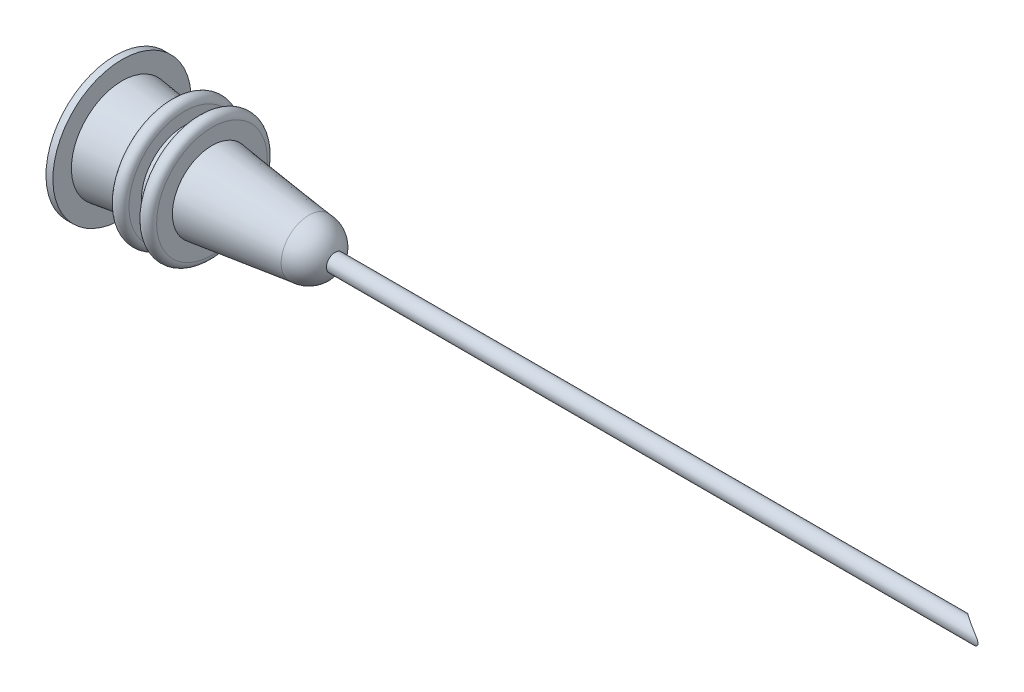
ISO-10303-21;
HEADER;
FILE_DESCRIPTION(('STEP AP214'),'2;1');
FILE_NAME('part.step','',(''),(''),'','','');
FILE_SCHEMA(('AUTOMOTIVE_DESIGN { 1 0 10303 214 1 1 1 1 }'));
ENDSEC;
DATA;
#1=APPLICATION_CONTEXT('core data for automotive mechanical design processes');
#2=APPLICATION_PROTOCOL_DEFINITION('international standard','automotive_design',2000,#1);
#3=PRODUCT_CONTEXT('',#1,'mechanical');
#4=PRODUCT('Part','Part','',(#3));
#5=PRODUCT_RELATED_PRODUCT_CATEGORY('part','',(#4));
#6=PRODUCT_DEFINITION_FORMATION('','',#4);
#7=PRODUCT_DEFINITION_CONTEXT('part definition',#1,'design');
#8=PRODUCT_DEFINITION('design','',#6,#7);
#9=PRODUCT_DEFINITION_SHAPE('','',#8);
#10=(LENGTH_UNIT() NAMED_UNIT(*) SI_UNIT(.MILLI.,.METRE.));
#11=(NAMED_UNIT(*) PLANE_ANGLE_UNIT() SI_UNIT($,.RADIAN.));
#12=(NAMED_UNIT(*) SI_UNIT($,.STERADIAN.) SOLID_ANGLE_UNIT());
#13=UNCERTAINTY_MEASURE_WITH_UNIT(LENGTH_MEASURE(1.E-05),#10,'distance_accuracy_value','');
#14=(GEOMETRIC_REPRESENTATION_CONTEXT(3) GLOBAL_UNCERTAINTY_ASSIGNED_CONTEXT((#13)) GLOBAL_UNIT_ASSIGNED_CONTEXT((#10,
#11,#12)) REPRESENTATION_CONTEXT('',''));
#15=CARTESIAN_POINT('',(0.,0.,0.));
#16=DIRECTION('',(0.,0.,1.));
#17=DIRECTION('',(1.,0.,0.));
#18=AXIS2_PLACEMENT_3D('',#15,#16,#17);
#19=CARTESIAN_POINT('',(0.,0.,0.));
#20=DIRECTION('',(0.,0.,1.));
#21=DIRECTION('',(1.,0.,0.));
#22=AXIS2_PLACEMENT_3D('',#19,#20,#21);
#23=SPHERICAL_SURFACE('',#22,2.);
#24=CARTESIAN_POINT('',(0.,0.,0.));
#25=DIRECTION('',(-1.,0.,0.));
#26=DIRECTION('',(0.,-1.,0.));
#27=AXIS2_PLACEMENT_3D('',#24,#25,#26);
#28=SPHERICAL_SURFACE('',#27,2.);
#29=CARTESIAN_POINT('',(1.89983551919633,0.,0.));
#30=DIRECTION('',(-1.,0.,0.));
#31=DIRECTION('',(0.,-1.,0.));
#32=AXIS2_PLACEMENT_3D('',#29,#30,#31);
#33=CIRCLE('',#32,0.625);
#34=CARTESIAN_POINT('',(1.89983551919633,-0.625,0.));
#35=VERTEX_POINT('',#34);
#36=EDGE_CURVE('E11',#35,#35,#33,.F.);
#37=ORIENTED_EDGE('',*,*,#36,.F.);
#38=EDGE_LOOP('',(#37));
#39=FACE_BOUND('',#38,.T.);
#40=CARTESIAN_POINT('',(0.,0.,0.));
#41=DIRECTION('',(1.,0.,0.));
#42=DIRECTION('',(0.,1.,0.));
#43=AXIS2_PLACEMENT_3D('',#40,#41,#42);
#44=CIRCLE('',#43,2.);
#45=CARTESIAN_POINT('',(0.,2.,0.));
#46=VERTEX_POINT('',#45);
#47=EDGE_CURVE('E39',#46,#46,#44,.T.);
#48=ORIENTED_EDGE('',*,*,#47,.T.);
#49=EDGE_LOOP('',(#48));
#50=FACE_BOUND('',#49,.T.);
#51=ADVANCED_FACE('F36',(#39,#50),#28,.T.);
#52=CARTESIAN_POINT('',(-1.,0.,0.));
#53=DIRECTION('',(-1.,0.,0.));
#54=DIRECTION('',(0.,-1.,0.));
#55=AXIS2_PLACEMENT_3D('',#52,#53,#54);
#56=PLANE('',#55);
#57=CARTESIAN_POINT('',(-1.,0.,0.));
#58=DIRECTION('',(1.,0.,0.));
#59=DIRECTION('',(0.,1.,0.));
#60=AXIS2_PLACEMENT_3D('',#57,#58,#59);
#61=CIRCLE('',#60,1.36741780015232);
#62=CARTESIAN_POINT('',(-1.,1.36741780015233,0.));
#63=VERTEX_POINT('',#62);
#64=EDGE_CURVE('E43',#63,#63,#61,.T.);
#65=ORIENTED_EDGE('',*,*,#64,.F.);
#66=EDGE_LOOP('',(#65));
#67=FACE_BOUND('',#66,.T.);
#68=CARTESIAN_POINT('',(-1.,0.,0.));
#69=DIRECTION('',(-1.,0.,0.));
#70=DIRECTION('',(0.,-1.,0.));
#71=AXIS2_PLACEMENT_3D('',#68,#69,#70);
#72=CIRCLE('',#71,0.5);
#73=CARTESIAN_POINT('',(-1.,-0.500000000000001,0.));
#74=VERTEX_POINT('',#73);
#75=EDGE_CURVE('E58',#74,#74,#72,.T.);
#76=ORIENTED_EDGE('',*,*,#75,.F.);
#77=EDGE_LOOP('',(#76));
#78=FACE_BOUND('',#77,.T.);
#79=ADVANCED_FACE('F102',(#67,#78),#56,.T.);
#80=CARTESIAN_POINT('',(-14.,0.,0.));
#81=DIRECTION('',(-1.,0.,0.));
#82=DIRECTION('',(0.,-1.,0.));
#83=AXIS2_PLACEMENT_3D('',#80,#81,#82);
#84=CONICAL_SURFACE('',#83,2.96741780015232,0.122461057417342);
#85=ORIENTED_EDGE('',*,*,#64,.T.);
#86=EDGE_LOOP('',(#85));
#87=FACE_BOUND('',#86,.T.);
#88=CARTESIAN_POINT('',(-14.,0.,0.));
#89=DIRECTION('',(1.,0.,0.));
#90=DIRECTION('',(0.,1.,0.));
#91=AXIS2_PLACEMENT_3D('',#88,#89,#90);
#92=CIRCLE('',#91,2.96741780015232);
#93=CARTESIAN_POINT('',(-14.,2.96741780015233,0.));
#94=VERTEX_POINT('',#93);
#95=EDGE_CURVE('E48',#94,#94,#92,.T.);
#96=ORIENTED_EDGE('',*,*,#95,.F.);
#97=EDGE_LOOP('',(#96));
#98=FACE_BOUND('',#97,.T.);
#99=ADVANCED_FACE('F100',(#87,#98),#84,.F.);
#100=CARTESIAN_POINT('',(-14.,2.96741780015233,0.));
#101=DIRECTION('',(-1.,0.,0.));
#102=DIRECTION('',(0.,-1.,0.));
#103=AXIS2_PLACEMENT_3D('',#100,#101,#102);
#104=PLANE('',#103);
#105=ORIENTED_EDGE('',*,*,#95,.T.);
#106=EDGE_LOOP('',(#105));
#107=FACE_BOUND('',#106,.T.);
#108=CARTESIAN_POINT('',(-14.,0.,0.));
#109=DIRECTION('',(1.,0.,0.));
#110=DIRECTION('',(0.,1.,0.));
#111=AXIS2_PLACEMENT_3D('',#108,#109,#110);
#112=CIRCLE('',#111,5.);
#113=CARTESIAN_POINT('',(-14.,5.,0.));
#114=VERTEX_POINT('',#113);
#115=EDGE_CURVE('E91',#114,#114,#112,.T.);
#116=ORIENTED_EDGE('',*,*,#115,.F.);
#117=EDGE_LOOP('',(#116));
#118=FACE_BOUND('',#117,.T.);
#119=ADVANCED_FACE('F97',(#107,#118),#104,.T.);
#120=CARTESIAN_POINT('',(18.5171919282144,0.,0.));
#121=DIRECTION('',(1.,0.,0.));
#122=DIRECTION('',(0.,1.,0.));
#123=AXIS2_PLACEMENT_3D('',#120,#121,#122);
#124=CYLINDRICAL_SURFACE('',#123,5.);
#125=ORIENTED_EDGE('',*,*,#115,.T.);
#126=EDGE_LOOP('',(#125));
#127=FACE_BOUND('',#126,.T.);
#128=CARTESIAN_POINT('',(-13.5,0.,0.));
#129=DIRECTION('',(1.,0.,0.));
#130=DIRECTION('',(0.,1.,0.));
#131=AXIS2_PLACEMENT_3D('',#128,#129,#130);
#132=CIRCLE('',#131,5.);
#133=CARTESIAN_POINT('',(-13.5,5.,0.));
#134=VERTEX_POINT('',#133);
#135=EDGE_CURVE('E88',#134,#134,#132,.T.);
#136=ORIENTED_EDGE('',*,*,#135,.F.);
#137=EDGE_LOOP('',(#136));
#138=FACE_BOUND('',#137,.T.);
#139=ADVANCED_FACE('F109',(#127,#138),#124,.T.);
#140=CARTESIAN_POINT('',(-13.5,5.,0.));
#141=DIRECTION('',(1.,0.,0.));
#142=DIRECTION('',(0.,1.,0.));
#143=AXIS2_PLACEMENT_3D('',#140,#141,#142);
#144=PLANE('',#143);
#145=ORIENTED_EDGE('',*,*,#135,.T.);
#146=EDGE_LOOP('',(#145));
#147=FACE_BOUND('',#146,.T.);
#148=CARTESIAN_POINT('',(-13.5,0.,0.));
#149=DIRECTION('',(1.,0.,0.));
#150=DIRECTION('',(0.,1.,0.));
#151=AXIS2_PLACEMENT_3D('',#148,#149,#150);
#152=CIRCLE('',#151,3.66153846153846);
#153=CARTESIAN_POINT('',(-13.5,3.66153846153846,0.));
#154=VERTEX_POINT('',#153);
#155=EDGE_CURVE('E85',#154,#154,#152,.T.);
#156=ORIENTED_EDGE('',*,*,#155,.F.);
#157=EDGE_LOOP('',(#156));
#158=FACE_BOUND('',#157,.T.);
#159=ADVANCED_FACE('F164',(#147,#158),#144,.T.);
#160=CARTESIAN_POINT('',(-10.,0.,0.));
#161=DIRECTION('',(-1.,0.,0.));
#162=DIRECTION('',(0.,-1.,0.));
#163=AXIS2_PLACEMENT_3D('',#160,#161,#162);
#164=CONICAL_SURFACE('',#163,3.23076923076923,0.122461057417342);
#165=ORIENTED_EDGE('',*,*,#155,.T.);
#166=EDGE_LOOP('',(#165));
#167=FACE_BOUND('',#166,.T.);
#168=CARTESIAN_POINT('',(-10.,0.,0.));
#169=DIRECTION('',(1.,0.,0.));
#170=DIRECTION('',(0.,1.,0.));
#171=AXIS2_PLACEMENT_3D('',#168,#169,#170);
#172=CIRCLE('',#171,3.23076923076923);
#173=CARTESIAN_POINT('',(-10.,3.23076923076923,0.));
#174=VERTEX_POINT('',#173);
#175=EDGE_CURVE('E82',#174,#174,#172,.T.);
#176=ORIENTED_EDGE('',*,*,#175,.F.);
#177=EDGE_LOOP('',(#176));
#178=FACE_BOUND('',#177,.T.);
#179=ADVANCED_FACE('F160',(#167,#178),#164,.T.);
#180=CARTESIAN_POINT('',(-10.,3.23076923076923,0.));
#181=DIRECTION('',(-1.,0.,0.));
#182=DIRECTION('',(0.,-1.,0.));
#183=AXIS2_PLACEMENT_3D('',#180,#181,#182);
#184=PLANE('',#183);
#185=ORIENTED_EDGE('',*,*,#175,.T.);
#186=EDGE_LOOP('',(#185));
#187=FACE_BOUND('',#186,.T.);
#188=CARTESIAN_POINT('',(-10.,0.,0.));
#189=DIRECTION('',(1.,0.,0.));
#190=DIRECTION('',(0.,1.,0.));
#191=AXIS2_PLACEMENT_3D('',#188,#189,#190);
#192=CIRCLE('',#191,4.);
#193=CARTESIAN_POINT('',(-10.,4.,0.));
#194=VERTEX_POINT('',#193);
#195=EDGE_CURVE('E79',#194,#194,#192,.T.);
#196=ORIENTED_EDGE('',*,*,#195,.F.);
#197=EDGE_LOOP('',(#196));
#198=FACE_BOUND('',#197,.T.);
#199=ADVANCED_FACE('F156',(#187,#198),#184,.T.);
#200=CARTESIAN_POINT('',(-9.5,0.,0.));
#201=DIRECTION('',(1.,0.,0.));
#202=DIRECTION('',(0.,1.,0.));
#203=AXIS2_PLACEMENT_3D('',#200,#201,#202);
#204=TOROIDAL_SURFACE('',#203,4.,0.5);
#205=ORIENTED_EDGE('',*,*,#195,.T.);
#206=EDGE_LOOP('',(#205));
#207=FACE_BOUND('',#206,.T.);
#208=CARTESIAN_POINT('',(-9.,0.,0.));
#209=DIRECTION('',(1.,0.,0.));
#210=DIRECTION('',(0.,1.,0.));
#211=AXIS2_PLACEMENT_3D('',#208,#209,#210);
#212=CIRCLE('',#211,4.);
#213=CARTESIAN_POINT('',(-9.,4.,0.));
#214=VERTEX_POINT('',#213);
#215=EDGE_CURVE('E76',#214,#214,#212,.T.);
#216=ORIENTED_EDGE('',*,*,#215,.F.);
#217=EDGE_LOOP('',(#216));
#218=FACE_BOUND('',#217,.T.);
#219=ADVANCED_FACE('F152',(#207,#218),#204,.T.);
#220=CARTESIAN_POINT('',(-9.,4.,0.));
#221=DIRECTION('',(1.,0.,0.));
#222=DIRECTION('',(0.,1.,0.));
#223=AXIS2_PLACEMENT_3D('',#220,#221,#222);
#224=PLANE('',#223);
#225=ORIENTED_EDGE('',*,*,#215,.T.);
#226=EDGE_LOOP('',(#225));
#227=FACE_BOUND('',#226,.T.);
#228=CARTESIAN_POINT('',(-9.,0.,0.));
#229=DIRECTION('',(1.,0.,0.));
#230=DIRECTION('',(0.,1.,0.));
#231=AXIS2_PLACEMENT_3D('',#228,#229,#230);
#232=CIRCLE('',#231,3.10769230769231);
#233=CARTESIAN_POINT('',(-9.,3.10769230769231,0.));
#234=VERTEX_POINT('',#233);
#235=EDGE_CURVE('E73',#234,#234,#232,.T.);
#236=ORIENTED_EDGE('',*,*,#235,.F.);
#237=EDGE_LOOP('',(#236));
#238=FACE_BOUND('',#237,.T.);
#239=ADVANCED_FACE('F148',(#227,#238),#224,.T.);
#240=CARTESIAN_POINT('',(-8.,0.,0.));
#241=DIRECTION('',(-1.,0.,0.));
#242=DIRECTION('',(0.,-1.,0.));
#243=AXIS2_PLACEMENT_3D('',#240,#241,#242);
#244=CONICAL_SURFACE('',#243,2.98461538461538,0.122461057417342);
#245=ORIENTED_EDGE('',*,*,#235,.T.);
#246=EDGE_LOOP('',(#245));
#247=FACE_BOUND('',#246,.T.);
#248=CARTESIAN_POINT('',(-8.,0.,0.));
#249=DIRECTION('',(1.,0.,0.));
#250=DIRECTION('',(0.,1.,0.));
#251=AXIS2_PLACEMENT_3D('',#248,#249,#250);
#252=CIRCLE('',#251,2.98461538461538);
#253=CARTESIAN_POINT('',(-8.,2.98461538461539,0.));
#254=VERTEX_POINT('',#253);
#255=EDGE_CURVE('E70',#254,#254,#252,.T.);
#256=ORIENTED_EDGE('',*,*,#255,.F.);
#257=EDGE_LOOP('',(#256));
#258=FACE_BOUND('',#257,.T.);
#259=ADVANCED_FACE('F144',(#247,#258),#244,.T.);
#260=CARTESIAN_POINT('',(-8.,2.98461538461539,0.));
#261=DIRECTION('',(-1.,0.,0.));
#262=DIRECTION('',(0.,-1.,0.));
#263=AXIS2_PLACEMENT_3D('',#260,#261,#262);
#264=PLANE('',#263);
#265=ORIENTED_EDGE('',*,*,#255,.T.);
#266=EDGE_LOOP('',(#265));
#267=FACE_BOUND('',#266,.T.);
#268=CARTESIAN_POINT('',(-8.,0.,0.));
#269=DIRECTION('',(1.,0.,0.));
#270=DIRECTION('',(0.,1.,0.));
#271=AXIS2_PLACEMENT_3D('',#268,#269,#270);
#272=CIRCLE('',#271,4.);
#273=CARTESIAN_POINT('',(-8.,4.,0.));
#274=VERTEX_POINT('',#273);
#275=EDGE_CURVE('E67',#274,#274,#272,.T.);
#276=ORIENTED_EDGE('',*,*,#275,.F.);
#277=EDGE_LOOP('',(#276));
#278=FACE_BOUND('',#277,.T.);
#279=ADVANCED_FACE('F140',(#267,#278),#264,.T.);
#280=CARTESIAN_POINT('',(-7.5,0.,0.));
#281=DIRECTION('',(1.,0.,0.));
#282=DIRECTION('',(0.,1.,0.));
#283=AXIS2_PLACEMENT_3D('',#280,#281,#282);
#284=TOROIDAL_SURFACE('',#283,4.,0.5);
#285=ORIENTED_EDGE('',*,*,#275,.T.);
#286=EDGE_LOOP('',(#285));
#287=FACE_BOUND('',#286,.T.);
#288=CARTESIAN_POINT('',(-7.,0.,0.));
#289=DIRECTION('',(1.,0.,0.));
#290=DIRECTION('',(0.,1.,0.));
#291=AXIS2_PLACEMENT_3D('',#288,#289,#290);
#292=CIRCLE('',#291,4.);
#293=CARTESIAN_POINT('',(-7.,4.,0.));
#294=VERTEX_POINT('',#293);
#295=EDGE_CURVE('E64',#294,#294,#292,.T.);
#296=ORIENTED_EDGE('',*,*,#295,.F.);
#297=EDGE_LOOP('',(#296));
#298=FACE_BOUND('',#297,.T.);
#299=ADVANCED_FACE('F132',(#287,#298),#284,.T.);
#300=CARTESIAN_POINT('',(-7.,4.,0.));
#301=DIRECTION('',(1.,0.,0.));
#302=DIRECTION('',(0.,1.,0.));
#303=AXIS2_PLACEMENT_3D('',#300,#301,#302);
#304=PLANE('',#303);
#305=ORIENTED_EDGE('',*,*,#295,.T.);
#306=EDGE_LOOP('',(#305));
#307=FACE_BOUND('',#306,.T.);
#308=CARTESIAN_POINT('',(-7.,0.,0.));
#309=DIRECTION('',(1.,0.,0.));
#310=DIRECTION('',(0.,1.,0.));
#311=AXIS2_PLACEMENT_3D('',#308,#309,#310);
#312=CIRCLE('',#311,2.86153846153846);
#313=CARTESIAN_POINT('',(-7.,2.86153846153846,0.));
#314=VERTEX_POINT('',#313);
#315=EDGE_CURVE('E61',#314,#314,#312,.T.);
#316=ORIENTED_EDGE('',*,*,#315,.F.);
#317=EDGE_LOOP('',(#316));
#318=FACE_BOUND('',#317,.T.);
#319=ADVANCED_FACE('F123',(#307,#318),#304,.T.);
#320=CARTESIAN_POINT('',(0.,0.,0.));
#321=DIRECTION('',(-1.,0.,0.));
#322=DIRECTION('',(0.,-1.,0.));
#323=AXIS2_PLACEMENT_3D('',#320,#321,#322);
#324=CONICAL_SURFACE('',#323,2.,0.122461057417342);
#325=ORIENTED_EDGE('',*,*,#315,.T.);
#326=EDGE_LOOP('',(#325));
#327=FACE_BOUND('',#326,.T.);
#328=ORIENTED_EDGE('',*,*,#47,.F.);
#329=EDGE_LOOP('',(#328));
#330=FACE_BOUND('',#329,.T.);
#331=ADVANCED_FACE('F120',(#327,#330),#324,.T.);
#332=CARTESIAN_POINT('',(9.,0.,0.));
#333=DIRECTION('',(-1.,0.,0.));
#334=DIRECTION('',(0.,-1.,0.));
#335=AXIS2_PLACEMENT_3D('',#332,#333,#334);
#336=CYLINDRICAL_SURFACE('',#335,0.5);
#337=CARTESIAN_POINT('',(47.7385558970049,-0.499999999999992,0.));
#338=CARTESIAN_POINT('',(47.676995088599,-0.500005799449973,-0.042235078169291));
#339=CARTESIAN_POINT('',(47.6162846639475,-0.494704632224763,-0.0859310378305494));
#340=CARTESIAN_POINT('',(47.5281793644801,-0.476774006721773,-0.152331963288639));
#341=CARTESIAN_POINT('',(47.4993668824095,-0.469162710452364,-0.174556619102596));
#342=CARTESIAN_POINT('',(47.4430232683984,-0.450144691354117,-0.218983594217453));
#343=CARTESIAN_POINT('',(47.4154904966899,-0.438742987282263,-0.241185904320831));
#344=CARTESIAN_POINT('',(47.3651681643776,-0.413100627015222,-0.282618268150626));
#345=CARTESIAN_POINT('',(47.3421923177107,-0.399319367330877,-0.301903296891395));
#346=CARTESIAN_POINT('',(47.2981452417519,-0.367871962624474,-0.339515025004838));
#347=CARTESIAN_POINT('',(47.2770733456276,-0.350207185251065,-0.357842058946733));
#348=CARTESIAN_POINT('',(47.2405683494316,-0.313593270816299,-0.390078261571014));
#349=CARTESIAN_POINT('',(47.2247641056315,-0.295239507964418,-0.404236878466846));
#350=CARTESIAN_POINT('',(47.195714770895,-0.255332596682865,-0.430550737831571));
#351=CARTESIAN_POINT('',(47.1824657217675,-0.233784489636015,-0.442709074522526));
#352=CARTESIAN_POINT('',(47.1619163987929,-0.192865755143483,-0.461725786313019));
#353=CARTESIAN_POINT('',(47.1539483972161,-0.174100803451653,-0.469161024481745));
#354=CARTESIAN_POINT('',(47.1404034600722,-0.135025720927264,-0.481859897051152));
#355=CARTESIAN_POINT('',(47.1348250190348,-0.114716572495238,-0.487124898664544));
#356=CARTESIAN_POINT('',(47.1263793254222,-0.0729109155432798,-0.495115365889011));
#357=CARTESIAN_POINT('',(47.1235290176812,-0.0514078526637709,-0.497824957973932));
#358=CARTESIAN_POINT('',(47.1208134173344,-0.00804527409233043,-0.500406140624675));
#359=CARTESIAN_POINT('',(47.1209470523331,0.0138141107192645,-0.500278750770059));
#360=CARTESIAN_POINT('',(47.1240233389691,0.054963128140177,-0.497355480554068));
#361=CARTESIAN_POINT('',(47.1266881142022,0.0742938624201266,-0.494823579595277));
#362=CARTESIAN_POINT('',(47.1342674416289,0.112097057181295,-0.487652081752012));
#363=CARTESIAN_POINT('',(47.1391822125315,0.130569434034277,-0.483012279971128));
#364=CARTESIAN_POINT('',(47.1512263274204,0.166937390667492,-0.471707674243391));
#365=CARTESIAN_POINT('',(47.1584309863832,0.18478623088042,-0.464974202528981));
#366=CARTESIAN_POINT('',(47.1746592613451,0.218907248272754,-0.449920094961737));
#367=CARTESIAN_POINT('',(47.1836838021563,0.235178617576186,-0.441598652263332));
#368=CARTESIAN_POINT('',(47.2084346937093,0.274236117592764,-0.418974395299195));
#369=CARTESIAN_POINT('',(47.2251767450906,0.295899706943548,-0.403840201371103));
#370=CARTESIAN_POINT('',(47.2612583572181,0.335358155095674,-0.371732828575432));
#371=CARTESIAN_POINT('',(47.2806042318336,0.353143325708012,-0.354755199633144));
#372=CARTESIAN_POINT('',(47.3307994701918,0.392706145922007,-0.311454534925781));
#373=CARTESIAN_POINT('',(47.3627591624382,0.412388295627073,-0.284512066709084));
#374=CARTESIAN_POINT('',(47.4292969725426,0.445136620876279,-0.229930369897814));
#375=CARTESIAN_POINT('',(47.463879349337,0.458191758555176,-0.202290058822603));
#376=CARTESIAN_POINT('',(47.5545549239408,0.484477361394398,-0.131846572969483));
#377=CARTESIAN_POINT('',(47.6118926791029,0.49374853825027,-0.0891802462609216));
#378=CARTESIAN_POINT('',(47.7288706531941,0.501708644813403,-0.0060300737365672));
#379=CARTESIAN_POINT('',(47.7885165269337,0.500369700704363,0.034447741930793));
#380=CARTESIAN_POINT('',(47.8886667563366,0.490732293894604,0.0993215233232987));
#381=CARTESIAN_POINT('',(47.9288899450182,0.484915464005122,0.124562382742691));
#382=CARTESIAN_POINT('',(48.009520150655,0.469602758680514,0.173590201011261));
#383=CARTESIAN_POINT('',(48.0499271503399,0.460107222105233,0.197377293538925));
#384=CARTESIAN_POINT('',(48.130661972557,0.437503085402526,0.243412608022169));
#385=CARTESIAN_POINT('',(48.1709896881466,0.424391171653714,0.26565939512222));
#386=CARTESIAN_POINT('',(48.251088366793,0.394388835112312,0.308447998887826));
#387=CARTESIAN_POINT('',(48.2908598603474,0.377502316697266,0.328991547462151));
#388=CARTESIAN_POINT('',(48.3680538625655,0.339961827175142,0.367604196441458));
#389=CARTESIAN_POINT('',(48.405510917831,0.319442752122185,0.385730726792278));
#390=CARTESIAN_POINT('',(48.4598376464581,0.284749820114463,0.411241729202922));
#391=CARTESIAN_POINT('',(48.4775945528335,0.272568506502724,0.419447117207181));
#392=CARTESIAN_POINT('',(48.5122103025202,0.246626060729753,0.435208955166236));
#393=CARTESIAN_POINT('',(48.5290701954962,0.232866837300773,0.442766170235407));
#394=CARTESIAN_POINT('',(48.5564802326784,0.207869621979354,0.454884377195974));
#395=CARTESIAN_POINT('',(48.5673919706924,0.197134441769109,0.459658443583044));
#396=CARTESIAN_POINT('',(48.5882630287371,0.174530550673737,0.468708474250497));
#397=CARTESIAN_POINT('',(48.5982208518927,0.16266011484232,0.472983657909155));
#398=CARTESIAN_POINT('',(48.6168230965664,0.137492065569914,0.480907686137349));
#399=CARTESIAN_POINT('',(48.6254514154017,0.124179848495268,0.484548912003253));
#400=CARTESIAN_POINT('',(48.6405295360908,0.0961639356013879,0.490873370115072));
#401=CARTESIAN_POINT('',(48.6469863171344,0.0814648958369086,0.493559673042062));
#402=CARTESIAN_POINT('',(48.6553041707183,0.055638652989779,0.497008572187478));
#403=CARTESIAN_POINT('',(48.6579696056039,0.044818537096487,0.498109446309158));
#404=CARTESIAN_POINT('',(48.6615782703273,0.0228479375843242,0.499598551687096));
#405=CARTESIAN_POINT('',(48.6625233524644,0.0116978224407893,0.499987549421222));
#406=CARTESIAN_POINT('',(48.6625824087183,-0.010627076446249,0.500011877510273));
#407=CARTESIAN_POINT('',(48.6616932911543,-0.0218018700734207,0.499645935357521));
#408=CARTESIAN_POINT('',(48.6581841072228,-0.0438291025475757,0.498198028549194));
#409=CARTESIAN_POINT('',(48.6555622959956,-0.0546812049138311,0.497115342114891));
#410=CARTESIAN_POINT('',(48.6477801301718,-0.0791906274744671,0.493889127468377));
#411=CARTESIAN_POINT('',(48.6420778306019,-0.0926434622379002,0.491517815690457));
#412=CARTESIAN_POINT('',(48.6288024048869,-0.118404457519575,0.485957902538559));
#413=CARTESIAN_POINT('',(48.6212247406698,-0.130709740208317,0.482767317946175));
#414=CARTESIAN_POINT('',(48.5988042232087,-0.162744509294986,0.47324797124608));
#415=CARTESIAN_POINT('',(48.5826786171725,-0.181384383760557,0.466321680969523));
#416=CARTESIAN_POINT('',(48.5483159151486,-0.216041530617397,0.451312582631556));
#417=CARTESIAN_POINT('',(48.5300726313543,-0.232050769523929,0.443226368201672));
#418=CARTESIAN_POINT('',(48.4908694529464,-0.263165950655662,0.425544095084656));
#419=CARTESIAN_POINT('',(48.4698086602716,-0.278103893201868,0.415879454694389));
#420=CARTESIAN_POINT('',(48.4267967966894,-0.30605618172315,0.395759014373298));
#421=CARTESIAN_POINT('',(48.4048447944099,-0.319068445667351,0.385302376335088));
#422=CARTESIAN_POINT('',(48.3380764204677,-0.355742827520275,0.352873391801643));
#423=CARTESIAN_POINT('',(48.2924240382065,-0.376986777673272,0.329876088816574));
#424=CARTESIAN_POINT('',(48.2043418542898,-0.412633820752165,0.2837261918552));
#425=CARTESIAN_POINT('',(48.1619817445635,-0.427474232725951,0.260765133571252));
#426=CARTESIAN_POINT('',(48.0769967719904,-0.453145063301073,0.213059370447299));
#427=CARTESIAN_POINT('',(48.0343717150755,-0.463972070360699,0.188313169415384));
#428=CARTESIAN_POINT('',(47.9492403946754,-0.481578579655976,0.137161818400044));
#429=CARTESIAN_POINT('',(47.9067342079239,-0.488355889249926,0.11075577825936));
#430=CARTESIAN_POINT('',(47.8222076065836,-0.49756510024624,0.0564560722256239));
#431=CARTESIAN_POINT('',(47.78018729713,-0.499996078036832,0.0285620914362457));
#432=CARTESIAN_POINT('',(47.7385558970049,-0.499999999999992,0.));
#433=B_SPLINE_CURVE_WITH_KNOTS('',3,(#337,#338,#339,#340,#341,#342,#343,#344,#345,#346,#347,
#348,#349,#350,#351,#352,#353,#354,#355,#356,#357,#358,#359,#360,#361,#362,#363,#364,#365,#366,
#367,#368,#369,#370,#371,#372,#373,#374,#375,#376,#377,#378,#379,#380,#381,#382,#383,#384,#385,
#386,#387,#388,#389,#390,#391,#392,#393,#394,#395,#396,#397,#398,#399,#400,#401,#402,#403,#404,
#405,#406,#407,#408,#409,#410,#411,#412,#413,#414,#415,#416,#417,#418,#419,#420,#421,#422,#423,
#424,#425,#426,#427,#428,#429,#430,#431,#432),.UNSPECIFIED.,.T.,.F.,(4,2,2,2,2,2,2,2,2,2,2,2,2,
2,2,2,2,2,2,2,2,2,2,2,2,2,2,2,2,2,2,2,2,2,2,2,2,2,2,2,2,2,2,2,2,2,2,4),(0.,0.2237486387854,
0.335114545003862,0.44633357863655,0.545128873176986,0.64388943080256,0.727757128965607,
0.811493847358526,0.876337159654838,0.941139559085291,1.00634189272978,1.07152079376349,
1.13028206253426,1.18904904435844,1.24999371006675,1.31096942451326,1.40428916303083,
1.49783940733853,1.63567450404434,1.77373842995119,1.98876737805068,2.20436141495405,
2.34773334072746,2.49109206309933,2.63458258139878,2.77792535714716,2.91676869564307,
2.98584499991837,3.0548386097277,3.10288541393603,3.15100641843081,3.19967086902068,
3.24817738607384,3.28163132551826,3.31504922383946,3.34852349654982,3.38203153004025,
3.42618805310517,3.47045249070085,3.54682646193052,3.62342949696849,3.7060107741131,
3.78868069530982,3.95431943373334,4.10539067674635,4.2565900429816,4.40787119960865,
4.55918450022829),.UNSPECIFIED.);
#434=CARTESIAN_POINT('',(47.7385558970049,-0.499999999999992,0.));
#435=VERTEX_POINT('',#434);
#436=EDGE_CURVE('E51',#435,#435,#433,.T.);
#437=ORIENTED_EDGE('',*,*,#436,.T.);
#438=EDGE_LOOP('',(#437));
#439=FACE_BOUND('',#438,.T.);
#440=ORIENTED_EDGE('',*,*,#75,.T.);
#441=EDGE_LOOP('',(#440));
#442=FACE_BOUND('',#441,.T.);
#443=ADVANCED_FACE('F122',(#439,#442),#336,.F.);
#444=CARTESIAN_POINT('',(49.,0.,0.));
#445=DIRECTION('',(-1.,0.,0.));
#446=DIRECTION('',(0.,-1.,0.));
#447=AXIS2_PLACEMENT_3D('',#444,#445,#446);
#448=CYLINDRICAL_SURFACE('',#447,0.625);
#449=CARTESIAN_POINT('',(49.,0.,0.625000000000005));
#450=CARTESIAN_POINT('',(48.999997504633,-0.0130546197228266,0.624999242386599));
#451=CARTESIAN_POINT('',(48.9987408940907,-0.0261198401982985,0.624585027973401));
#452=CARTESIAN_POINT('',(48.9939084793772,-0.0517685208615485,0.622985975853795));
#453=CARTESIAN_POINT('',(48.9903275456894,-0.0643508501600859,0.621799433691675));
#454=CARTESIAN_POINT('',(48.9800429247604,-0.0921392694169425,0.618371038020387));
#455=CARTESIAN_POINT('',(48.9727461499708,-0.107095681715166,0.615926910488362));
#456=CARTESIAN_POINT('',(48.9560615388944,-0.135623424293231,0.610281652728423));
#457=CARTESIAN_POINT('',(48.9466686211422,-0.14919126981093,0.607078681730445));
#458=CARTESIAN_POINT('',(48.9176574433014,-0.186467243425673,0.597070819410832));
#459=CARTESIAN_POINT('',(48.8963045968828,-0.208614035186578,0.589573340089065));
#460=CARTESIAN_POINT('',(48.8512142470825,-0.249768947000832,0.573347560518146));
#461=CARTESIAN_POINT('',(48.8274690638752,-0.268766405301207,0.564615257571459));
#462=CARTESIAN_POINT('',(48.7671825861441,-0.31282549573358,0.541884553558653));
#463=CARTESIAN_POINT('',(48.7298714072862,-0.336542017849314,0.527339736092507));
#464=CARTESIAN_POINT('',(48.6538510365987,-0.380444595589772,0.496589058565635));
#465=CARTESIAN_POINT('',(48.6151393173881,-0.400623840848945,0.480380087552572));
#466=CARTESIAN_POINT('',(48.5368441392908,-0.438178855511771,0.446393909429972));
#467=CARTESIAN_POINT('',(48.497257896556,-0.45554352492143,0.428610901207875));
#468=CARTESIAN_POINT('',(48.4177226666741,-0.487723497944525,0.391600855990397));
#469=CARTESIAN_POINT('',(48.3777735860408,-0.502538123717309,0.372373436993475));
#470=CARTESIAN_POINT('',(48.2838488408882,-0.534485134544284,0.325590498349462));
#471=CARTESIAN_POINT('',(48.2298210045135,-0.550635164384168,0.297462048974395));
#472=CARTESIAN_POINT('',(48.121932541738,-0.578529676719338,0.238715872095485));
#473=CARTESIAN_POINT('',(48.0680720530007,-0.590271174790889,0.208096475306247));
#474=CARTESIAN_POINT('',(47.9611539469562,-0.608932892767005,0.144621011974778));
#475=CARTESIAN_POINT('',(47.9080938143464,-0.615874468101873,0.111775575869763));
#476=CARTESIAN_POINT('',(47.802976696333,-0.624390118984196,0.0439284897487323));
#477=CARTESIAN_POINT('',(47.7509188029656,-0.625969304370549,0.00892892481468737));
#478=CARTESIAN_POINT('',(47.6464385872934,-0.622808376667789,-0.064210196998984));
#479=CARTESIAN_POINT('',(47.5940686771293,-0.617842434223797,-0.102417064674883));
#480=CARTESIAN_POINT('',(47.491694418036,-0.59979606104108,-0.180171850905099));
#481=CARTESIAN_POINT('',(47.4416889797564,-0.586719407025388,-0.219719137200487));
#482=CARTESIAN_POINT('',(47.3556974128494,-0.55451856370176,-0.290343052557305));
#483=CARTESIAN_POINT('',(47.3190062808826,-0.537295386407734,-0.321415485206135));
#484=CARTESIAN_POINT('',(47.2488828348655,-0.495685692022085,-0.382466681088634));
#485=CARTESIAN_POINT('',(47.215444622695,-0.471312474213518,-0.41244735966158));
#486=CARTESIAN_POINT('',(47.1628102621803,-0.423168786985563,-0.460797026152366));
#487=CARTESIAN_POINT('',(47.1423869977255,-0.401495937613194,-0.479911990981752));
#488=CARTESIAN_POINT('',(47.1045038277979,-0.354059016624329,-0.515897588312211));
#489=CARTESIAN_POINT('',(47.087040064311,-0.328300357471769,-0.532771136427177));
#490=CARTESIAN_POINT('',(47.0587765317935,-0.277918735562701,-0.560404193916788));
#491=CARTESIAN_POINT('',(47.0473418411024,-0.253958884811611,-0.571717415632104));
#492=CARTESIAN_POINT('',(47.0275032722944,-0.203699653625649,-0.591488784332454));
#493=CARTESIAN_POINT('',(47.0190979786492,-0.177401373035409,-0.599948264649641));
#494=CARTESIAN_POINT('',(47.0057422996531,-0.122880705722466,-0.61344808374771));
#495=CARTESIAN_POINT('',(47.000815785086,-0.0946464560496674,-0.618464792342618));
#496=CARTESIAN_POINT('',(46.9948491330842,-0.0373530764002971,-0.624546118836505));
#497=CARTESIAN_POINT('',(46.993806823306,-0.00829441666301983,-0.625612945808274));
#498=CARTESIAN_POINT('',(46.9955675744498,0.0462294280472811,-0.623815525121713));
#499=CARTESIAN_POINT('',(46.9979439324818,0.0717250377165061,-0.621387473645399));
#500=CARTESIAN_POINT('',(47.0056570428835,0.121783279962823,-0.613543508643197));
#501=CARTESIAN_POINT('',(47.0109937166825,0.146345937283214,-0.608127674417021));
#502=CARTESIAN_POINT('',(47.024413788057,0.194152541337382,-0.594602901530949));
#503=CARTESIAN_POINT('',(47.0325197191181,0.217383783502232,-0.58647188201476));
#504=CARTESIAN_POINT('',(47.0511145012348,0.261915204539201,-0.56798577466518));
#505=CARTESIAN_POINT('',(47.0616044306842,0.283214503383766,-0.557629680442551));
#506=CARTESIAN_POINT('',(47.0896700196187,0.332574311924514,-0.530215460596248));
#507=CARTESIAN_POINT('',(47.1083338519422,0.359493495464724,-0.512211917123592));
#508=CARTESIAN_POINT('',(47.1488873426166,0.408804917004896,-0.473799019780917));
#509=CARTESIAN_POINT('',(47.1707838567366,0.431187288019706,-0.453384571816304));
#510=CARTESIAN_POINT('',(47.2267491573156,0.480161033070722,-0.402241632950504));
#511=CARTESIAN_POINT('',(47.2620635092804,0.504561996862489,-0.370787013121386));
#512=CARTESIAN_POINT('',(47.3360147610827,0.545777812289656,-0.306919629272492));
#513=CARTESIAN_POINT('',(47.3746566476625,0.562581033627115,-0.274505476702184));
#514=CARTESIAN_POINT('',(47.4757731386482,0.59711115440041,-0.192375492117858));
#515=CARTESIAN_POINT('',(47.5398382094751,0.610426226016544,-0.142779822645123));
#516=CARTESIAN_POINT('',(47.6712539735757,0.625211685781455,-0.0461618959373477));
#517=CARTESIAN_POINT('',(47.738614211438,0.626645331391285,0.000851932206952794));
#518=CARTESIAN_POINT('',(47.8581978392801,0.620787790417191,0.0800205570571817));
#519=CARTESIAN_POINT('',(47.9100235954619,0.61557597283132,0.112964847967548));
#520=CARTESIAN_POINT('',(48.0143721944337,0.600410461631078,0.176650402577261));
#521=CARTESIAN_POINT('',(48.0668954771846,0.590453622123387,0.207390189138214));
#522=CARTESIAN_POINT('',(48.1721464950296,0.566247111218738,0.266469935491859));
#523=CARTESIAN_POINT('',(48.2248736163359,0.552006010775508,0.294814543313136));
#524=CARTESIAN_POINT('',(48.3302525695689,0.519390067089881,0.349087969864352));
#525=CARTESIAN_POINT('',(48.3829044283352,0.501018072430444,0.375018435996891));
#526=CARTESIAN_POINT('',(48.4718639163817,0.466135140843024,0.416947132453266));
#527=CARTESIAN_POINT('',(48.5083104180833,0.450734789886831,0.433581779309786));
#528=CARTESIAN_POINT('',(48.580735007614,0.41756658821698,0.465613816427171));
#529=CARTESIAN_POINT('',(48.6167125712711,0.399796302258158,0.481009907556539));
#530=CARTESIAN_POINT('',(48.6909186991249,0.359735135072174,0.511772539360171));
#531=CARTESIAN_POINT('',(48.7290585245615,0.337181367590201,0.527011771462594));
#532=CARTESIAN_POINT('',(48.8031126442329,0.287685007754234,0.555597084048991));
#533=CARTESIAN_POINT('',(48.8390346995453,0.260759077161282,0.56895000524101));
#534=CARTESIAN_POINT('',(48.8855411105701,0.21848397109898,0.58570548424447));
#535=CARTESIAN_POINT('',(48.8982956546572,0.205998872159622,0.590236828101819));
#536=CARTESIAN_POINT('',(48.9226197389308,0.179675795340563,0.598777494231961));
#537=CARTESIAN_POINT('',(48.9341864467782,0.16583473091409,0.602785574705202));
#538=CARTESIAN_POINT('',(48.9556418737573,0.136326152045061,0.610144304535733));
#539=CARTESIAN_POINT('',(48.9654982341079,0.120631268332596,0.613482431409936));
#540=CARTESIAN_POINT('',(48.9821061318536,0.0875171343658325,0.619065460420708));
#541=CARTESIAN_POINT('',(48.9888776263573,0.0701098802026005,0.621317395265262));
#542=CARTESIAN_POINT('',(48.9955693870707,0.0436002494988173,0.623536050639604));
#543=CARTESIAN_POINT('',(48.997219036302,0.0349750456494431,0.624081473630723));
#544=CARTESIAN_POINT('',(48.9994352397125,0.0175681728770915,0.624813722202214));
#545=CARTESIAN_POINT('',(49.0000016795212,0.00878648753081169,0.625000509916102));
#546=CARTESIAN_POINT('',(49.,0.,0.625000000000005));
#547=B_SPLINE_CURVE_WITH_KNOTS('',3,(#449,#450,#451,#452,#453,#454,#455,#456,#457,#458,#459,
#460,#461,#462,#463,#464,#465,#466,#467,#468,#469,#470,#471,#472,#473,#474,#475,#476,#477,#478,
#479,#480,#481,#482,#483,#484,#485,#486,#487,#488,#489,#490,#491,#492,#493,#494,#495,#496,#497,
#498,#499,#500,#501,#502,#503,#504,#505,#506,#507,#508,#509,#510,#511,#512,#513,#514,#515,#516,
#517,#518,#519,#520,#521,#522,#523,#524,#525,#526,#527,#528,#529,#530,#531,#532,#533,#534,#535,
#536,#537,#538,#539,#540,#541,#542,#543,#544,#545,#546),.UNSPECIFIED.,.T.,.F.,(4,2,2,2,2,2,2,2,
2,2,2,2,2,2,2,2,2,2,2,2,2,2,2,2,2,2,2,2,2,2,2,2,2,2,2,2,2,2,2,2,2,2,2,2,2,2,2,2,4),(0.,
0.0391216795936564,0.0783299911822102,0.128497773165711,0.178788519029841,0.273253897061206,
0.368032821144664,0.507347656870718,0.646927839611357,0.787045760092171,0.927200868737188,
1.11603910639365,1.30500495150622,1.49312455976819,1.68106485786023,1.8756625446941,
2.07016968578796,2.22291908626233,2.37538615063406,2.48119988651983,2.58687460413351,
2.6731052373124,2.75929552561851,2.8460716361363,2.9327992075473,3.00959471936244,
3.08638819302101,3.16382203771076,3.24129097931415,3.35279910202184,3.4645471982029,
3.62330554636895,3.78230609902895,4.02726653948491,4.27298422262427,4.45764783776469,
4.64243405338027,4.82685302263103,5.01114520811907,5.13984053617717,5.26866913994817,
5.40908958982588,5.54898695994526,5.60416356163466,5.65946881512186,5.71572732949464,
5.77161653040225,5.79794482406865,5.82427589745353),.UNSPECIFIED.);
#548=CARTESIAN_POINT('',(49.,0.,0.625000000000005));
#549=VERTEX_POINT('',#548);
#550=EDGE_CURVE('E280',#549,#549,#547,.T.);
#551=ORIENTED_EDGE('',*,*,#550,.F.);
#552=EDGE_LOOP('',(#551));
#553=FACE_BOUND('',#552,.T.);
#554=ORIENTED_EDGE('',*,*,#36,.T.);
#555=EDGE_LOOP('',(#554));
#556=FACE_BOUND('',#555,.T.);
#557=ADVANCED_FACE('F130',(#553,#556),#448,.T.);
#558=CARTESIAN_POINT('',(50.566966107213,-25.,-4.12311722884405));
#559=DIRECTION('',(0.,1.,0.));
#560=DIRECTION('',(0.,0.,1.));
#561=AXIS2_PLACEMENT_3D('',#558,#559,#560);
#562=CYLINDRICAL_SURFACE('',#561,5.);
#563=ORIENTED_EDGE('',*,*,#550,.T.);
#564=EDGE_LOOP('',(#563));
#565=FACE_BOUND('',#564,.T.);
#566=ORIENTED_EDGE('',*,*,#436,.F.);
#567=EDGE_LOOP('',(#566));
#568=FACE_BOUND('',#567,.T.);
#569=ADVANCED_FACE('F263',(#565,#568),#562,.F.);
#570=CLOSED_SHELL('',(#51,#79,#99,#119,#139,#159,#179,#199,#219,#239,#259,#279,#299,#319,#331,
#443,#557,#569));
#571=MANIFOLD_SOLID_BREP('B2',#570);
#572=ADVANCED_BREP_SHAPE_REPRESENTATION('',(#18,#571),#14);
#573=SHAPE_DEFINITION_REPRESENTATION(#9,#572);
ENDSEC;
END-ISO-10303-21;
